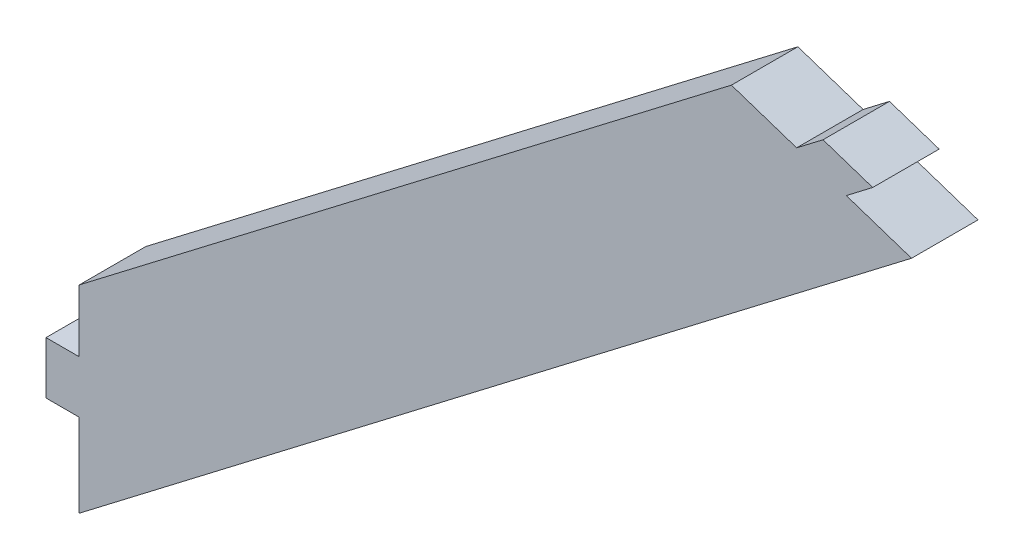
ISO-10303-21;
HEADER;
FILE_DESCRIPTION(('STEP AP214'),'2;1');
FILE_NAME('part.step','',(''),(''),'','','');
FILE_SCHEMA(('AUTOMOTIVE_DESIGN { 1 0 10303 214 1 1 1 1 }'));
ENDSEC;
DATA;
#1=APPLICATION_CONTEXT('core data for automotive mechanical design processes');
#2=APPLICATION_PROTOCOL_DEFINITION('international standard','automotive_design',2000,#1);
#3=PRODUCT_CONTEXT('',#1,'mechanical');
#4=PRODUCT('Part','Part','',(#3));
#5=PRODUCT_RELATED_PRODUCT_CATEGORY('part','',(#4));
#6=PRODUCT_DEFINITION_FORMATION('','',#4);
#7=PRODUCT_DEFINITION_CONTEXT('part definition',#1,'design');
#8=PRODUCT_DEFINITION('design','',#6,#7);
#9=PRODUCT_DEFINITION_SHAPE('','',#8);
#10=(LENGTH_UNIT() NAMED_UNIT(*) SI_UNIT(.MILLI.,.METRE.));
#11=(NAMED_UNIT(*) PLANE_ANGLE_UNIT() SI_UNIT($,.RADIAN.));
#12=(NAMED_UNIT(*) SI_UNIT($,.STERADIAN.) SOLID_ANGLE_UNIT());
#13=UNCERTAINTY_MEASURE_WITH_UNIT(LENGTH_MEASURE(1.E-05),#10,'distance_accuracy_value','');
#14=(GEOMETRIC_REPRESENTATION_CONTEXT(3) GLOBAL_UNCERTAINTY_ASSIGNED_CONTEXT((#13)) GLOBAL_UNIT_ASSIGNED_CONTEXT((#10,
#11,#12)) REPRESENTATION_CONTEXT('',''));
#15=CARTESIAN_POINT('',(0.,0.,0.));
#16=DIRECTION('',(0.,0.,1.));
#17=DIRECTION('',(1.,0.,0.));
#18=AXIS2_PLACEMENT_3D('',#15,#16,#17);
#19=CARTESIAN_POINT('',(1.4345913314749,-24.6991715903541,6.35));
#20=DIRECTION('',(0.607747251155396,-0.794130517429635,0.));
#21=DIRECTION('',(0.794130517429636,0.607747251155396,0.));
#22=AXIS2_PLACEMENT_3D('',#19,#20,#21);
#23=PLANE('',#22);
#24=DIRECTION('',(-0.794130517429635,-0.607747251155396,0.));
#25=VECTOR('',#24,1.);
#26=CARTESIAN_POINT('',(1.4345913314749,-24.6991715903541,0.));
#27=LINE('',#26,#25);
#28=CARTESIAN_POINT('',(33.0965828738396,-0.468282707932394,0.));
#29=VERTEX_POINT('',#28);
#30=CARTESIAN_POINT('',(-29.2012263653619,-48.1447307062712,0.));
#31=VERTEX_POINT('',#30);
#32=EDGE_CURVE('E106',#29,#31,#27,.T.);
#33=ORIENTED_EDGE('',*,*,#32,.T.);
#34=DIRECTION('',(0.,0.,-1.));
#35=VECTOR('',#34,1.);
#36=CARTESIAN_POINT('',(-29.2012263653619,-48.1447307062712,6.35));
#37=LINE('',#36,#35);
#38=CARTESIAN_POINT('',(-29.2012263653619,-48.1447307062712,6.35));
#39=VERTEX_POINT('',#38);
#40=EDGE_CURVE('E11',#39,#31,#37,.T.);
#41=ORIENTED_EDGE('',*,*,#40,.F.);
#42=DIRECTION('',(0.794130517429635,0.607747251155396,0.));
#43=VECTOR('',#42,1.);
#44=CARTESIAN_POINT('',(1.4345913314749,-24.6991715903541,6.35));
#45=LINE('',#44,#43);
#46=CARTESIAN_POINT('',(33.0965828738396,-0.468282707932394,6.35));
#47=VERTEX_POINT('',#46);
#48=EDGE_CURVE('E60',#39,#47,#45,.T.);
#49=ORIENTED_EDGE('',*,*,#48,.T.);
#50=DIRECTION('',(0.,0.,-1.));
#51=VECTOR('',#50,1.);
#52=CARTESIAN_POINT('',(33.0965828738396,-0.468282707932394,6.35));
#53=LINE('',#52,#51);
#54=EDGE_CURVE('E45',#47,#29,#53,.T.);
#55=ORIENTED_EDGE('',*,*,#54,.T.);
#56=EDGE_LOOP('',(#33,#41,#49,#55));
#57=FACE_BOUND('',#56,.T.);
#58=ADVANCED_FACE('F41',(#57),#23,.F.);
#59=CARTESIAN_POINT('',(-29.2012263653619,-48.1447307062712,6.35));
#60=DIRECTION('',(1.,0.,0.));
#61=DIRECTION('',(0.,0.,-1.));
#62=AXIS2_PLACEMENT_3D('',#59,#60,#61);
#63=PLANE('',#62);
#64=DIRECTION('',(0.,-1.,0.));
#65=VECTOR('',#64,1.);
#66=CARTESIAN_POINT('',(-29.2012263653619,-48.1447307062712,0.));
#67=LINE('',#66,#65);
#68=CARTESIAN_POINT('',(-29.2012263653619,-54.0890220858234,0.));
#69=VERTEX_POINT('',#68);
#70=EDGE_CURVE('E100',#31,#69,#67,.T.);
#71=ORIENTED_EDGE('',*,*,#70,.T.);
#72=DIRECTION('',(0.,0.,-1.));
#73=VECTOR('',#72,1.);
#74=CARTESIAN_POINT('',(-29.2012263653619,-54.0890220858234,6.35));
#75=LINE('',#74,#73);
#76=CARTESIAN_POINT('',(-29.2012263653619,-54.0890220858234,6.35));
#77=VERTEX_POINT('',#76);
#78=EDGE_CURVE('E51',#77,#69,#75,.T.);
#79=ORIENTED_EDGE('',*,*,#78,.F.);
#80=DIRECTION('',(0.,-1.,0.));
#81=VECTOR('',#80,1.);
#82=CARTESIAN_POINT('',(-29.2012263653619,-48.1447307062712,6.35));
#83=LINE('',#82,#81);
#84=EDGE_CURVE('E145',#39,#77,#83,.T.);
#85=ORIENTED_EDGE('',*,*,#84,.F.);
#86=ORIENTED_EDGE('',*,*,#40,.T.);
#87=EDGE_LOOP('',(#71,#79,#85,#86));
#88=FACE_BOUND('',#87,.T.);
#89=ADVANCED_FACE('F268',(#88),#63,.F.);
#90=CARTESIAN_POINT('',(-29.2012263653619,-54.0890220858234,6.35));
#91=DIRECTION('',(0.,-1.,0.));
#92=DIRECTION('',(0.,0.,-1.));
#93=AXIS2_PLACEMENT_3D('',#90,#91,#92);
#94=PLANE('',#93);
#95=DIRECTION('',(-1.,0.,0.));
#96=VECTOR('',#95,1.);
#97=CARTESIAN_POINT('',(-29.2012263653619,-54.0890220858234,0.));
#98=LINE('',#97,#96);
#99=CARTESIAN_POINT('',(-32.3762263653619,-54.0890220858234,0.));
#100=VERTEX_POINT('',#99);
#101=EDGE_CURVE('E152',#69,#100,#98,.T.);
#102=ORIENTED_EDGE('',*,*,#101,.T.);
#103=DIRECTION('',(0.,0.,-1.));
#104=VECTOR('',#103,1.);
#105=CARTESIAN_POINT('',(-32.3762263653619,-54.0890220858234,6.35));
#106=LINE('',#105,#104);
#107=CARTESIAN_POINT('',(-32.3762263653619,-54.0890220858234,6.35));
#108=VERTEX_POINT('',#107);
#109=EDGE_CURVE('E149',#108,#100,#106,.T.);
#110=ORIENTED_EDGE('',*,*,#109,.F.);
#111=DIRECTION('',(-1.,0.,0.));
#112=VECTOR('',#111,1.);
#113=CARTESIAN_POINT('',(-29.2012263653619,-54.0890220858234,6.35));
#114=LINE('',#113,#112);
#115=EDGE_CURVE('E138',#77,#108,#114,.T.);
#116=ORIENTED_EDGE('',*,*,#115,.F.);
#117=ORIENTED_EDGE('',*,*,#78,.T.);
#118=EDGE_LOOP('',(#102,#110,#116,#117));
#119=FACE_BOUND('',#118,.T.);
#120=ADVANCED_FACE('F150',(#119),#94,.F.);
#121=CARTESIAN_POINT('',(-32.3762263653619,-54.0890220858234,6.35));
#122=DIRECTION('',(1.,0.,0.));
#123=DIRECTION('',(0.,0.,-1.));
#124=AXIS2_PLACEMENT_3D('',#121,#122,#123);
#125=PLANE('',#124);
#126=DIRECTION('',(0.,-1.,0.));
#127=VECTOR('',#126,1.);
#128=CARTESIAN_POINT('',(-32.3762263653619,-54.0890220858234,0.));
#129=LINE('',#128,#127);
#130=CARTESIAN_POINT('',(-32.3762263653619,-59.0890220858234,0.));
#131=VERTEX_POINT('',#130);
#132=EDGE_CURVE('E189',#100,#131,#129,.T.);
#133=ORIENTED_EDGE('',*,*,#132,.T.);
#134=DIRECTION('',(0.,0.,-1.));
#135=VECTOR('',#134,1.);
#136=CARTESIAN_POINT('',(-32.3762263653619,-59.0890220858234,6.35));
#137=LINE('',#136,#135);
#138=CARTESIAN_POINT('',(-32.3762263653619,-59.0890220858234,6.35));
#139=VERTEX_POINT('',#138);
#140=EDGE_CURVE('E155',#139,#131,#137,.T.);
#141=ORIENTED_EDGE('',*,*,#140,.F.);
#142=DIRECTION('',(0.,-1.,0.));
#143=VECTOR('',#142,1.);
#144=CARTESIAN_POINT('',(-32.3762263653619,-54.0890220858234,6.35));
#145=LINE('',#144,#143);
#146=EDGE_CURVE('E142',#108,#139,#145,.T.);
#147=ORIENTED_EDGE('',*,*,#146,.F.);
#148=ORIENTED_EDGE('',*,*,#109,.T.);
#149=EDGE_LOOP('',(#133,#141,#147,#148));
#150=FACE_BOUND('',#149,.T.);
#151=ADVANCED_FACE('F157',(#150),#125,.F.);
#152=CARTESIAN_POINT('',(-32.3762263653619,-59.0890220858234,6.35));
#153=DIRECTION('',(0.,1.,0.));
#154=DIRECTION('',(0.,0.,1.));
#155=AXIS2_PLACEMENT_3D('',#152,#153,#154);
#156=PLANE('',#155);
#157=DIRECTION('',(1.,0.,0.));
#158=VECTOR('',#157,1.);
#159=CARTESIAN_POINT('',(-32.3762263653619,-59.0890220858234,0.));
#160=LINE('',#159,#158);
#161=CARTESIAN_POINT('',(-29.2012263653619,-59.0890220858234,0.));
#162=VERTEX_POINT('',#161);
#163=EDGE_CURVE('E187',#131,#162,#160,.T.);
#164=ORIENTED_EDGE('',*,*,#163,.T.);
#165=DIRECTION('',(0.,0.,-1.));
#166=VECTOR('',#165,1.);
#167=CARTESIAN_POINT('',(-29.2012263653619,-59.0890220858234,6.35));
#168=LINE('',#167,#166);
#169=CARTESIAN_POINT('',(-29.2012263653619,-59.0890220858234,6.35));
#170=VERTEX_POINT('',#169);
#171=EDGE_CURVE('E196',#170,#162,#168,.T.);
#172=ORIENTED_EDGE('',*,*,#171,.F.);
#173=DIRECTION('',(1.,0.,0.));
#174=VECTOR('',#173,1.);
#175=CARTESIAN_POINT('',(-32.3762263653619,-59.0890220858234,6.35));
#176=LINE('',#175,#174);
#177=EDGE_CURVE('E160',#139,#170,#176,.T.);
#178=ORIENTED_EDGE('',*,*,#177,.F.);
#179=ORIENTED_EDGE('',*,*,#140,.T.);
#180=EDGE_LOOP('',(#164,#172,#178,#179));
#181=FACE_BOUND('',#180,.T.);
#182=ADVANCED_FACE('F216',(#181),#156,.F.);
#183=CARTESIAN_POINT('',(-29.2012263653619,-59.0890220858234,6.35));
#184=DIRECTION('',(1.,0.,0.));
#185=DIRECTION('',(0.,0.,-1.));
#186=AXIS2_PLACEMENT_3D('',#183,#184,#185);
#187=PLANE('',#186);
#188=DIRECTION('',(0.,-1.,0.));
#189=VECTOR('',#188,1.);
#190=CARTESIAN_POINT('',(-29.2012263653619,-59.0890220858234,0.));
#191=LINE('',#190,#189);
#192=CARTESIAN_POINT('',(-29.2012263653619,-67.0333134653755,0.));
#193=VERTEX_POINT('',#192);
#194=EDGE_CURVE('E185',#162,#193,#191,.T.);
#195=ORIENTED_EDGE('',*,*,#194,.T.);
#196=DIRECTION('',(0.,0.,-1.));
#197=VECTOR('',#196,1.);
#198=CARTESIAN_POINT('',(-29.2012263653619,-67.0333134653755,6.35));
#199=LINE('',#198,#197);
#200=CARTESIAN_POINT('',(-29.2012263653619,-67.0333134653755,6.35));
#201=VERTEX_POINT('',#200);
#202=EDGE_CURVE('E199',#201,#193,#199,.T.);
#203=ORIENTED_EDGE('',*,*,#202,.F.);
#204=DIRECTION('',(0.,-1.,0.));
#205=VECTOR('',#204,1.);
#206=CARTESIAN_POINT('',(-29.2012263653619,-59.0890220858234,6.35));
#207=LINE('',#206,#205);
#208=EDGE_CURVE('E162',#170,#201,#207,.T.);
#209=ORIENTED_EDGE('',*,*,#208,.F.);
#210=ORIENTED_EDGE('',*,*,#171,.T.);
#211=EDGE_LOOP('',(#195,#203,#209,#210));
#212=FACE_BOUND('',#211,.T.);
#213=ADVANCED_FACE('F225',(#212),#187,.F.);
#214=CARTESIAN_POINT('',(-29.2012263653619,-67.0333134653755,6.35));
#215=DIRECTION('',(-0.607747251155395,0.794130517429636,0.));
#216=DIRECTION('',(-0.794130517429636,-0.607747251155395,0.));
#217=AXIS2_PLACEMENT_3D('',#214,#215,#216);
#218=PLANE('',#217);
#219=DIRECTION('',(0.794130517429636,0.607747251155395,0.));
#220=VECTOR('',#219,1.);
#221=CARTESIAN_POINT('',(-29.2012263653619,-67.0333134653755,0.));
#222=LINE('',#221,#220);
#223=CARTESIAN_POINT('',(50.3028265629734,-6.18894523822174,0.));
#224=VERTEX_POINT('',#223);
#225=EDGE_CURVE('E182',#193,#224,#222,.T.);
#226=ORIENTED_EDGE('',*,*,#225,.T.);
#227=DIRECTION('',(0.,0.,-1.));
#228=VECTOR('',#227,1.);
#229=CARTESIAN_POINT('',(50.3028265629734,-6.18894523822174,6.35));
#230=LINE('',#229,#228);
#231=CARTESIAN_POINT('',(50.3028265629734,-6.18894523822174,6.35));
#232=VERTEX_POINT('',#231);
#233=EDGE_CURVE('E202',#232,#224,#230,.T.);
#234=ORIENTED_EDGE('',*,*,#233,.F.);
#235=DIRECTION('',(0.794130517429636,0.607747251155395,0.));
#236=VECTOR('',#235,1.);
#237=CARTESIAN_POINT('',(-29.2012263653619,-67.0333134653755,6.35));
#238=LINE('',#237,#236);
#239=EDGE_CURVE('E222',#201,#232,#238,.T.);
#240=ORIENTED_EDGE('',*,*,#239,.F.);
#241=ORIENTED_EDGE('',*,*,#202,.T.);
#242=EDGE_LOOP('',(#226,#234,#240,#241));
#243=FACE_BOUND('',#242,.T.);
#244=ADVANCED_FACE('F228',(#243),#218,.F.);
#245=CARTESIAN_POINT('',(44.0720224398221,-4.11735260447367,6.35));
#246=DIRECTION('',(0.31549545255864,0.94892708856625,0.));
#247=DIRECTION('',(-0.94892708856625,0.31549545255864,0.));
#248=AXIS2_PLACEMENT_3D('',#245,#246,#247);
#249=PLANE('',#248);
#250=DIRECTION('',(0.94892708856625,-0.31549545255864,0.));
#251=VECTOR('',#250,1.);
#252=CARTESIAN_POINT('',(44.0720224398221,-4.11735260447367,0.));
#253=LINE('',#252,#251);
#254=CARTESIAN_POINT('',(44.0720224398221,-4.11735260447367,0.));
#255=VERTEX_POINT('',#254);
#256=EDGE_CURVE('E179',#255,#224,#253,.T.);
#257=ORIENTED_EDGE('',*,*,#256,.F.);
#258=DIRECTION('',(0.,0.,-1.));
#259=VECTOR('',#258,1.);
#260=CARTESIAN_POINT('',(44.0720224398221,-4.11735260447367,6.35));
#261=LINE('',#260,#259);
#262=CARTESIAN_POINT('',(44.0720224398221,-4.11735260447367,6.35));
#263=VERTEX_POINT('',#262);
#264=EDGE_CURVE('E204',#263,#255,#261,.T.);
#265=ORIENTED_EDGE('',*,*,#264,.F.);
#266=DIRECTION('',(0.94892708856625,-0.31549545255864,0.));
#267=VECTOR('',#266,1.);
#268=CARTESIAN_POINT('',(44.0720224398221,-4.11735260447367,6.35));
#269=LINE('',#268,#267);
#270=EDGE_CURVE('E230',#263,#232,#269,.T.);
#271=ORIENTED_EDGE('',*,*,#270,.T.);
#272=ORIENTED_EDGE('',*,*,#233,.T.);
#273=EDGE_LOOP('',(#257,#265,#271,#272));
#274=FACE_BOUND('',#273,.T.);
#275=ADVANCED_FACE('F256',(#274),#249,.T.);
#276=CARTESIAN_POINT('',(44.0720224398221,-4.11735260447367,6.35));
#277=DIRECTION('',(-0.607747251155395,0.794130517429636,0.));
#278=DIRECTION('',(-0.794130517429636,-0.607747251155395,0.));
#279=AXIS2_PLACEMENT_3D('',#276,#277,#278);
#280=PLANE('',#279);
#281=DIRECTION('',(0.794130517429636,0.607747251155395,0.));
#282=VECTOR('',#281,1.);
#283=CARTESIAN_POINT('',(44.0720224398221,-4.11735260447367,0.));
#284=LINE('',#283,#282);
#285=CARTESIAN_POINT('',(46.5933868326612,-2.18775508205529,0.));
#286=VERTEX_POINT('',#285);
#287=EDGE_CURVE('E176',#255,#286,#284,.T.);
#288=ORIENTED_EDGE('',*,*,#287,.T.);
#289=DIRECTION('',(0.,0.,-1.));
#290=VECTOR('',#289,1.);
#291=CARTESIAN_POINT('',(46.5933868326612,-2.18775508205529,6.35));
#292=LINE('',#291,#290);
#293=CARTESIAN_POINT('',(46.5933868326612,-2.18775508205529,6.35));
#294=VERTEX_POINT('',#293);
#295=EDGE_CURVE('E206',#294,#286,#292,.T.);
#296=ORIENTED_EDGE('',*,*,#295,.F.);
#297=DIRECTION('',(0.794130517429636,0.607747251155395,0.));
#298=VECTOR('',#297,1.);
#299=CARTESIAN_POINT('',(44.0720224398221,-4.11735260447367,6.35));
#300=LINE('',#299,#298);
#301=EDGE_CURVE('E232',#263,#294,#300,.T.);
#302=ORIENTED_EDGE('',*,*,#301,.F.);
#303=ORIENTED_EDGE('',*,*,#264,.T.);
#304=EDGE_LOOP('',(#288,#296,#302,#303));
#305=FACE_BOUND('',#304,.T.);
#306=ADVANCED_FACE('F258',(#305),#280,.F.);
#307=CARTESIAN_POINT('',(41.84875138983,-0.610277819262092,6.35));
#308=DIRECTION('',(0.315495452558639,0.94892708856625,0.));
#309=DIRECTION('',(-0.94892708856625,0.315495452558639,0.));
#310=AXIS2_PLACEMENT_3D('',#307,#308,#309);
#311=PLANE('',#310);
#312=DIRECTION('',(0.94892708856625,-0.315495452558639,0.));
#313=VECTOR('',#312,1.);
#314=CARTESIAN_POINT('',(41.84875138983,-0.610277819262092,0.));
#315=LINE('',#314,#313);
#316=CARTESIAN_POINT('',(41.84875138983,-0.610277819262092,0.));
#317=VERTEX_POINT('',#316);
#318=EDGE_CURVE('E173',#317,#286,#315,.T.);
#319=ORIENTED_EDGE('',*,*,#318,.F.);
#320=DIRECTION('',(0.,0.,-1.));
#321=VECTOR('',#320,1.);
#322=CARTESIAN_POINT('',(41.84875138983,-0.610277819262092,6.35));
#323=LINE('',#322,#321);
#324=CARTESIAN_POINT('',(41.84875138983,-0.610277819262092,6.35));
#325=VERTEX_POINT('',#324);
#326=EDGE_CURVE('E208',#325,#317,#323,.T.);
#327=ORIENTED_EDGE('',*,*,#326,.F.);
#328=DIRECTION('',(0.94892708856625,-0.315495452558639,0.));
#329=VECTOR('',#328,1.);
#330=CARTESIAN_POINT('',(41.84875138983,-0.610277819262092,6.35));
#331=LINE('',#330,#329);
#332=EDGE_CURVE('E236',#325,#294,#331,.T.);
#333=ORIENTED_EDGE('',*,*,#332,.T.);
#334=ORIENTED_EDGE('',*,*,#295,.T.);
#335=EDGE_LOOP('',(#319,#327,#333,#334));
#336=FACE_BOUND('',#335,.T.);
#337=ADVANCED_FACE('F250',(#336),#311,.T.);
#338=CARTESIAN_POINT('',(39.3273869969909,-2.53987534168047,6.35));
#339=DIRECTION('',(-0.607747251155394,0.794130517429636,0.));
#340=DIRECTION('',(-0.794130517429637,-0.607747251155394,0.));
#341=AXIS2_PLACEMENT_3D('',#338,#339,#340);
#342=PLANE('',#341);
#343=DIRECTION('',(0.794130517429637,0.607747251155394,0.));
#344=VECTOR('',#343,1.);
#345=CARTESIAN_POINT('',(39.3273869969909,-2.53987534168047,0.));
#346=LINE('',#345,#344);
#347=CARTESIAN_POINT('',(39.3273869969909,-2.53987534168047,0.));
#348=VERTEX_POINT('',#347);
#349=EDGE_CURVE('E170',#348,#317,#346,.T.);
#350=ORIENTED_EDGE('',*,*,#349,.F.);
#351=DIRECTION('',(0.,0.,-1.));
#352=VECTOR('',#351,1.);
#353=CARTESIAN_POINT('',(39.3273869969909,-2.53987534168047,6.35));
#354=LINE('',#353,#352);
#355=CARTESIAN_POINT('',(39.3273869969909,-2.53987534168047,6.35));
#356=VERTEX_POINT('',#355);
#357=EDGE_CURVE('E209',#356,#348,#354,.T.);
#358=ORIENTED_EDGE('',*,*,#357,.F.);
#359=DIRECTION('',(0.794130517429637,0.607747251155394,0.));
#360=VECTOR('',#359,1.);
#361=CARTESIAN_POINT('',(39.3273869969909,-2.53987534168047,6.35));
#362=LINE('',#361,#360);
#363=EDGE_CURVE('E239',#356,#325,#362,.T.);
#364=ORIENTED_EDGE('',*,*,#363,.T.);
#365=ORIENTED_EDGE('',*,*,#326,.T.);
#366=EDGE_LOOP('',(#350,#358,#364,#365));
#367=FACE_BOUND('',#366,.T.);
#368=ADVANCED_FACE('F247',(#367),#342,.T.);
#369=CARTESIAN_POINT('',(33.0965828738396,-0.468282707932394,6.35));
#370=DIRECTION('',(0.315495452558639,0.94892708856625,0.));
#371=DIRECTION('',(-0.94892708856625,0.315495452558639,0.));
#372=AXIS2_PLACEMENT_3D('',#369,#370,#371);
#373=PLANE('',#372);
#374=DIRECTION('',(0.94892708856625,-0.315495452558639,0.));
#375=VECTOR('',#374,1.);
#376=CARTESIAN_POINT('',(33.0965828738396,-0.468282707932394,0.));
#377=LINE('',#376,#375);
#378=EDGE_CURVE('E167',#29,#348,#377,.T.);
#379=ORIENTED_EDGE('',*,*,#378,.F.);
#380=ORIENTED_EDGE('',*,*,#54,.F.);
#381=DIRECTION('',(0.94892708856625,-0.315495452558639,0.));
#382=VECTOR('',#381,1.);
#383=CARTESIAN_POINT('',(33.0965828738396,-0.468282707932394,6.35));
#384=LINE('',#383,#382);
#385=EDGE_CURVE('E242',#47,#356,#384,.T.);
#386=ORIENTED_EDGE('',*,*,#385,.T.);
#387=ORIENTED_EDGE('',*,*,#357,.T.);
#388=EDGE_LOOP('',(#379,#380,#386,#387));
#389=FACE_BOUND('',#388,.T.);
#390=ADVANCED_FACE('F43',(#389),#373,.T.);
#391=CARTESIAN_POINT('',(0.,0.,6.35));
#392=DIRECTION('',(0.,0.,-1.));
#393=DIRECTION('',(-1.,0.,0.));
#394=AXIS2_PLACEMENT_3D('',#391,#392,#393);
#395=PLANE('',#394);
#396=ORIENTED_EDGE('',*,*,#48,.F.);
#397=ORIENTED_EDGE('',*,*,#84,.T.);
#398=ORIENTED_EDGE('',*,*,#115,.T.);
#399=ORIENTED_EDGE('',*,*,#146,.T.);
#400=ORIENTED_EDGE('',*,*,#177,.T.);
#401=ORIENTED_EDGE('',*,*,#208,.T.);
#402=ORIENTED_EDGE('',*,*,#239,.T.);
#403=ORIENTED_EDGE('',*,*,#270,.F.);
#404=ORIENTED_EDGE('',*,*,#301,.T.);
#405=ORIENTED_EDGE('',*,*,#332,.F.);
#406=ORIENTED_EDGE('',*,*,#363,.F.);
#407=ORIENTED_EDGE('',*,*,#385,.F.);
#408=EDGE_LOOP('',(#396,#397,#398,#399,#400,#401,#402,#403,#404,#405,#406,#407));
#409=FACE_BOUND('',#408,.T.);
#410=ADVANCED_FACE('F140',(#409),#395,.F.);
#411=CARTESIAN_POINT('',(0.,0.,0.));
#412=DIRECTION('',(0.,0.,-1.));
#413=DIRECTION('',(-1.,0.,0.));
#414=AXIS2_PLACEMENT_3D('',#411,#412,#413);
#415=PLANE('',#414);
#416=ORIENTED_EDGE('',*,*,#32,.F.);
#417=ORIENTED_EDGE('',*,*,#378,.T.);
#418=ORIENTED_EDGE('',*,*,#349,.T.);
#419=ORIENTED_EDGE('',*,*,#318,.T.);
#420=ORIENTED_EDGE('',*,*,#287,.F.);
#421=ORIENTED_EDGE('',*,*,#256,.T.);
#422=ORIENTED_EDGE('',*,*,#225,.F.);
#423=ORIENTED_EDGE('',*,*,#194,.F.);
#424=ORIENTED_EDGE('',*,*,#163,.F.);
#425=ORIENTED_EDGE('',*,*,#132,.F.);
#426=ORIENTED_EDGE('',*,*,#101,.F.);
#427=ORIENTED_EDGE('',*,*,#70,.F.);
#428=EDGE_LOOP('',(#416,#417,#418,#419,#420,#421,#422,#423,#424,#425,#426,#427));
#429=FACE_BOUND('',#428,.T.);
#430=ADVANCED_FACE('F212',(#429),#415,.T.);
#431=CLOSED_SHELL('',(#58,#89,#120,#151,#182,#213,#244,#275,#306,#337,#368,#390,#410,#430));
#432=MANIFOLD_SOLID_BREP('B2',#431);
#433=ADVANCED_BREP_SHAPE_REPRESENTATION('',(#18,#432),#14);
#434=SHAPE_DEFINITION_REPRESENTATION(#9,#433);
ENDSEC;
END-ISO-10303-21;
